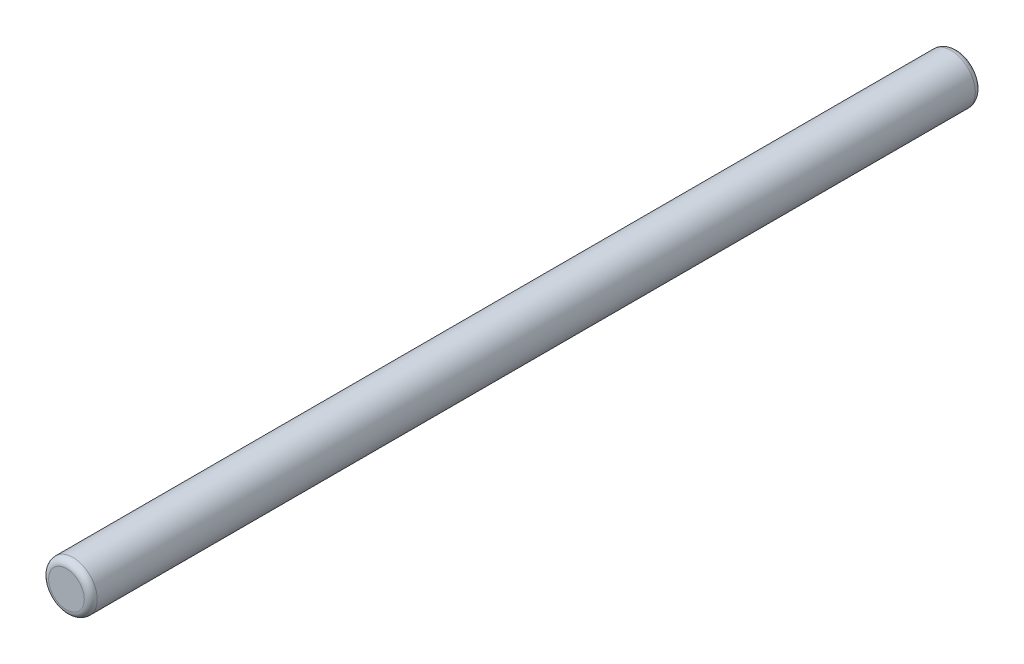
ISO-10303-21;
HEADER;
FILE_DESCRIPTION(('STEP AP214'),'2;1');
FILE_NAME('part.step','',(''),(''),'','','');
FILE_SCHEMA(('AUTOMOTIVE_DESIGN { 1 0 10303 214 1 1 1 1 }'));
ENDSEC;
DATA;
#1=APPLICATION_CONTEXT('core data for automotive mechanical design processes');
#2=APPLICATION_PROTOCOL_DEFINITION('international standard','automotive_design',2000,#1);
#3=PRODUCT_CONTEXT('',#1,'mechanical');
#4=PRODUCT('Part','Part','',(#3));
#5=PRODUCT_RELATED_PRODUCT_CATEGORY('part','',(#4));
#6=PRODUCT_DEFINITION_FORMATION('','',#4);
#7=PRODUCT_DEFINITION_CONTEXT('part definition',#1,'design');
#8=PRODUCT_DEFINITION('design','',#6,#7);
#9=PRODUCT_DEFINITION_SHAPE('','',#8);
#10=(LENGTH_UNIT() NAMED_UNIT(*) SI_UNIT(.MILLI.,.METRE.));
#11=(NAMED_UNIT(*) PLANE_ANGLE_UNIT() SI_UNIT($,.RADIAN.));
#12=(NAMED_UNIT(*) SI_UNIT($,.STERADIAN.) SOLID_ANGLE_UNIT());
#13=UNCERTAINTY_MEASURE_WITH_UNIT(LENGTH_MEASURE(1.E-05),#10,'distance_accuracy_value','');
#14=(GEOMETRIC_REPRESENTATION_CONTEXT(3) GLOBAL_UNCERTAINTY_ASSIGNED_CONTEXT((#13)) GLOBAL_UNIT_ASSIGNED_CONTEXT((#10,
#11,#12)) REPRESENTATION_CONTEXT('',''));
#15=CARTESIAN_POINT('',(0.,0.,0.));
#16=DIRECTION('',(0.,0.,1.));
#17=DIRECTION('',(1.,0.,0.));
#18=AXIS2_PLACEMENT_3D('',#15,#16,#17);
#19=CARTESIAN_POINT('',(0.,0.,137.5));
#20=DIRECTION('',(0.,0.,-1.));
#21=DIRECTION('',(-1.,0.,0.));
#22=AXIS2_PLACEMENT_3D('',#19,#20,#21);
#23=CYLINDRICAL_SURFACE('',#22,7.5);
#24=CARTESIAN_POINT('',(0.,0.,-135.5));
#25=DIRECTION('',(0.,0.,1.));
#26=DIRECTION('',(1.,0.,0.));
#27=AXIS2_PLACEMENT_3D('',#24,#25,#26);
#28=CIRCLE('',#27,7.5);
#29=CARTESIAN_POINT('',(7.5,0.,-135.5));
#30=VERTEX_POINT('',#29);
#31=EDGE_CURVE('E62',#30,#30,#28,.T.);
#32=ORIENTED_EDGE('',*,*,#31,.T.);
#33=EDGE_LOOP('',(#32));
#34=FACE_BOUND('',#33,.T.);
#35=CARTESIAN_POINT('',(0.,0.,135.5));
#36=DIRECTION('',(0.,0.,1.));
#37=DIRECTION('',(1.,0.,0.));
#38=AXIS2_PLACEMENT_3D('',#35,#36,#37);
#39=CIRCLE('',#38,7.5);
#40=CARTESIAN_POINT('',(7.5,0.,135.5));
#41=VERTEX_POINT('',#40);
#42=EDGE_CURVE('E69',#41,#41,#39,.F.);
#43=ORIENTED_EDGE('',*,*,#42,.T.);
#44=EDGE_LOOP('',(#43));
#45=FACE_BOUND('',#44,.T.);
#46=ADVANCED_FACE('F47',(#34,#45),#23,.T.);
#47=CARTESIAN_POINT('',(0.,0.,137.5));
#48=DIRECTION('',(0.,0.,1.));
#49=DIRECTION('',(1.,0.,0.));
#50=AXIS2_PLACEMENT_3D('',#47,#48,#49);
#51=PLANE('',#50);
#52=CARTESIAN_POINT('',(0.,0.,137.5));
#53=DIRECTION('',(0.,0.,1.));
#54=DIRECTION('',(1.,0.,0.));
#55=AXIS2_PLACEMENT_3D('',#52,#53,#54);
#56=CIRCLE('',#55,5.5);
#57=CARTESIAN_POINT('',(5.5,0.,137.5));
#58=VERTEX_POINT('',#57);
#59=EDGE_CURVE('E10',#58,#58,#56,.T.);
#60=ORIENTED_EDGE('',*,*,#59,.T.);
#61=EDGE_LOOP('',(#60));
#62=FACE_BOUND('',#61,.T.);
#63=ADVANCED_FACE('F88',(#62),#51,.T.);
#64=CARTESIAN_POINT('',(0.,0.,-137.5));
#65=DIRECTION('',(0.,0.,1.));
#66=DIRECTION('',(1.,0.,0.));
#67=AXIS2_PLACEMENT_3D('',#64,#65,#66);
#68=PLANE('',#67);
#69=CARTESIAN_POINT('',(0.,0.,-137.5));
#70=DIRECTION('',(0.,0.,1.));
#71=DIRECTION('',(1.,0.,0.));
#72=AXIS2_PLACEMENT_3D('',#69,#70,#71);
#73=CIRCLE('',#72,5.5);
#74=CARTESIAN_POINT('',(5.5,0.,-137.5));
#75=VERTEX_POINT('',#74);
#76=EDGE_CURVE('E55',#75,#75,#73,.F.);
#77=ORIENTED_EDGE('',*,*,#76,.T.);
#78=EDGE_LOOP('',(#77));
#79=FACE_BOUND('',#78,.T.);
#80=ADVANCED_FACE('F85',(#79),#68,.F.);
#81=CARTESIAN_POINT('',(0.,0.,-135.5));
#82=DIRECTION('',(0.,0.,1.));
#83=DIRECTION('',(1.,0.,0.));
#84=AXIS2_PLACEMENT_3D('',#81,#82,#83);
#85=TOROIDAL_SURFACE('',#84,5.5,2.);
#86=ORIENTED_EDGE('',*,*,#76,.F.);
#87=EDGE_LOOP('',(#86));
#88=FACE_BOUND('',#87,.T.);
#89=ORIENTED_EDGE('',*,*,#31,.F.);
#90=EDGE_LOOP('',(#89));
#91=FACE_BOUND('',#90,.T.);
#92=ADVANCED_FACE('F81',(#88,#91),#85,.T.);
#93=CARTESIAN_POINT('',(0.,0.,135.5));
#94=DIRECTION('',(0.,0.,1.));
#95=DIRECTION('',(1.,0.,0.));
#96=AXIS2_PLACEMENT_3D('',#93,#94,#95);
#97=TOROIDAL_SURFACE('',#96,5.5,2.);
#98=ORIENTED_EDGE('',*,*,#42,.F.);
#99=EDGE_LOOP('',(#98));
#100=FACE_BOUND('',#99,.T.);
#101=ORIENTED_EDGE('',*,*,#59,.F.);
#102=EDGE_LOOP('',(#101));
#103=FACE_BOUND('',#102,.T.);
#104=ADVANCED_FACE('F49',(#100,#103),#97,.T.);
#105=CLOSED_SHELL('',(#46,#63,#80,#92,#104));
#106=MANIFOLD_SOLID_BREP('B2',#105);
#107=ADVANCED_BREP_SHAPE_REPRESENTATION('',(#18,#106),#14);
#108=SHAPE_DEFINITION_REPRESENTATION(#9,#107);
ENDSEC;
END-ISO-10303-21;
